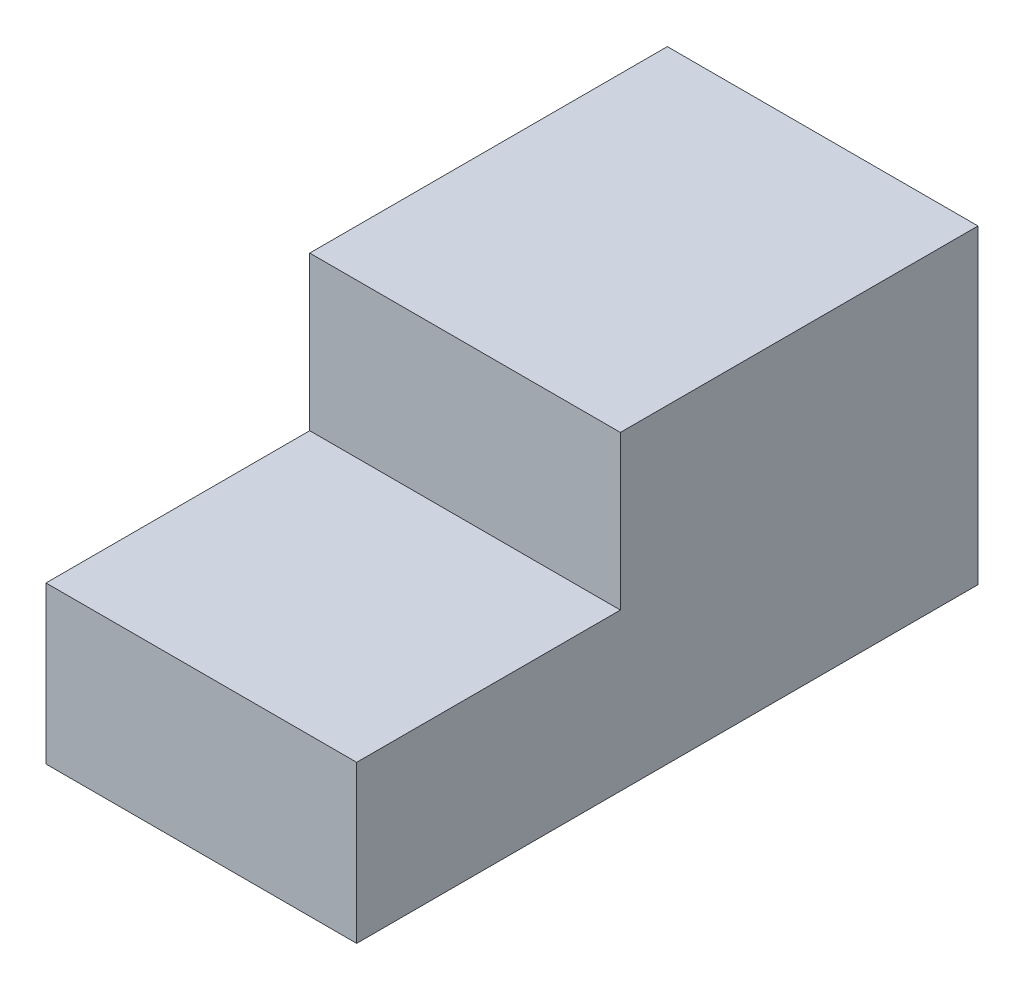
ISO-10303-21;
HEADER;
FILE_DESCRIPTION(('STEP AP214'),'2;1');
FILE_NAME('part.step','',(''),(''),'','','');
FILE_SCHEMA(('AUTOMOTIVE_DESIGN { 1 0 10303 214 1 1 1 1 }'));
ENDSEC;
DATA;
#1=APPLICATION_CONTEXT('core data for automotive mechanical design processes');
#2=APPLICATION_PROTOCOL_DEFINITION('international standard','automotive_design',2000,#1);
#3=PRODUCT_CONTEXT('',#1,'mechanical');
#4=PRODUCT('Part','Part','',(#3));
#5=PRODUCT_RELATED_PRODUCT_CATEGORY('part','',(#4));
#6=PRODUCT_DEFINITION_FORMATION('','',#4);
#7=PRODUCT_DEFINITION_CONTEXT('part definition',#1,'design');
#8=PRODUCT_DEFINITION('design','',#6,#7);
#9=PRODUCT_DEFINITION_SHAPE('','',#8);
#10=(LENGTH_UNIT() NAMED_UNIT(*) SI_UNIT(.MILLI.,.METRE.));
#11=(NAMED_UNIT(*) PLANE_ANGLE_UNIT() SI_UNIT($,.RADIAN.));
#12=(NAMED_UNIT(*) SI_UNIT($,.STERADIAN.) SOLID_ANGLE_UNIT());
#13=UNCERTAINTY_MEASURE_WITH_UNIT(LENGTH_MEASURE(1.E-05),#10,'distance_accuracy_value','');
#14=(GEOMETRIC_REPRESENTATION_CONTEXT(3) GLOBAL_UNCERTAINTY_ASSIGNED_CONTEXT((#13)) GLOBAL_UNIT_ASSIGNED_CONTEXT((#10,
#11,#12)) REPRESENTATION_CONTEXT('',''));
#15=CARTESIAN_POINT('',(0.,0.,0.));
#16=DIRECTION('',(0.,0.,1.));
#17=DIRECTION('',(1.,0.,0.));
#18=AXIS2_PLACEMENT_3D('',#15,#16,#17);
#19=CARTESIAN_POINT('',(500.,-252.411575562701,0.));
#20=DIRECTION('',(0.,1.,0.));
#21=DIRECTION('',(0.,0.,1.));
#22=AXIS2_PLACEMENT_3D('',#19,#20,#21);
#23=PLANE('',#22);
#24=DIRECTION('',(0.,0.,-1.));
#25=VECTOR('',#24,1.);
#26=CARTESIAN_POINT('',(-500.,-252.411575562701,0.));
#27=LINE('',#26,#25);
#28=CARTESIAN_POINT('',(-500.,-252.411575562701,1000.));
#29=VERTEX_POINT('',#28);
#30=CARTESIAN_POINT('',(-500.,-252.411575562701,-1000.));
#31=VERTEX_POINT('',#30);
#32=EDGE_CURVE('E130',#29,#31,#27,.T.);
#33=ORIENTED_EDGE('',*,*,#32,.T.);
#34=DIRECTION('',(-1.,0.,0.));
#35=VECTOR('',#34,1.);
#36=CARTESIAN_POINT('',(500.,-252.411575562701,-1000.));
#37=LINE('',#36,#35);
#38=CARTESIAN_POINT('',(500.,-252.411575562701,-1000.));
#39=VERTEX_POINT('',#38);
#40=EDGE_CURVE('E11',#39,#31,#37,.T.);
#41=ORIENTED_EDGE('',*,*,#40,.F.);
#42=DIRECTION('',(0.,0.,-1.));
#43=VECTOR('',#42,1.);
#44=CARTESIAN_POINT('',(500.,-252.411575562701,0.));
#45=LINE('',#44,#43);
#46=CARTESIAN_POINT('',(500.,-252.411575562701,1000.));
#47=VERTEX_POINT('',#46);
#48=EDGE_CURVE('E150',#47,#39,#45,.T.);
#49=ORIENTED_EDGE('',*,*,#48,.F.);
#50=DIRECTION('',(-1.,0.,0.));
#51=VECTOR('',#50,1.);
#52=CARTESIAN_POINT('',(500.,-252.411575562701,1000.));
#53=LINE('',#52,#51);
#54=EDGE_CURVE('E58',#47,#29,#53,.T.);
#55=ORIENTED_EDGE('',*,*,#54,.T.);
#56=EDGE_LOOP('',(#33,#41,#49,#55));
#57=FACE_BOUND('',#56,.T.);
#58=ADVANCED_FACE('F41',(#57),#23,.F.);
#59=CARTESIAN_POINT('',(500.,0.,-1000.));
#60=DIRECTION('',(0.,0.,1.));
#61=DIRECTION('',(1.,0.,0.));
#62=AXIS2_PLACEMENT_3D('',#59,#60,#61);
#63=PLANE('',#62);
#64=DIRECTION('',(0.,1.,0.));
#65=VECTOR('',#64,1.);
#66=CARTESIAN_POINT('',(-500.,0.,-1000.));
#67=LINE('',#66,#65);
#68=CARTESIAN_POINT('',(-500.,747.588424437299,-1000.));
#69=VERTEX_POINT('',#68);
#70=EDGE_CURVE('E133',#31,#69,#67,.T.);
#71=ORIENTED_EDGE('',*,*,#70,.T.);
#72=DIRECTION('',(-1.,0.,0.));
#73=VECTOR('',#72,1.);
#74=CARTESIAN_POINT('',(500.,747.588424437299,-1000.));
#75=LINE('',#74,#73);
#76=CARTESIAN_POINT('',(500.,747.588424437299,-1000.));
#77=VERTEX_POINT('',#76);
#78=EDGE_CURVE('E50',#77,#69,#75,.T.);
#79=ORIENTED_EDGE('',*,*,#78,.F.);
#80=DIRECTION('',(0.,1.,0.));
#81=VECTOR('',#80,1.);
#82=CARTESIAN_POINT('',(500.,0.,-1000.));
#83=LINE('',#82,#81);
#84=EDGE_CURVE('E90',#39,#77,#83,.T.);
#85=ORIENTED_EDGE('',*,*,#84,.F.);
#86=ORIENTED_EDGE('',*,*,#40,.T.);
#87=EDGE_LOOP('',(#71,#79,#85,#86));
#88=FACE_BOUND('',#87,.T.);
#89=ADVANCED_FACE('F160',(#88),#63,.F.);
#90=CARTESIAN_POINT('',(500.,747.588424437299,0.));
#91=DIRECTION('',(0.,1.,0.));
#92=DIRECTION('',(0.,0.,1.));
#93=AXIS2_PLACEMENT_3D('',#90,#91,#92);
#94=PLANE('',#93);
#95=DIRECTION('',(0.,0.,-1.));
#96=VECTOR('',#95,1.);
#97=CARTESIAN_POINT('',(-500.,747.588424437299,0.));
#98=LINE('',#97,#96);
#99=CARTESIAN_POINT('',(-500.,747.588424437299,151.125401929261));
#100=VERTEX_POINT('',#99);
#101=EDGE_CURVE('E137',#100,#69,#98,.T.);
#102=ORIENTED_EDGE('',*,*,#101,.F.);
#103=DIRECTION('',(-1.,0.,0.));
#104=VECTOR('',#103,1.);
#105=CARTESIAN_POINT('',(500.,747.588424437299,151.125401929261));
#106=LINE('',#105,#104);
#107=CARTESIAN_POINT('',(500.,747.588424437299,151.125401929261));
#108=VERTEX_POINT('',#107);
#109=EDGE_CURVE('E110',#108,#100,#106,.T.);
#110=ORIENTED_EDGE('',*,*,#109,.F.);
#111=DIRECTION('',(0.,0.,-1.));
#112=VECTOR('',#111,1.);
#113=CARTESIAN_POINT('',(500.,747.588424437299,0.));
#114=LINE('',#113,#112);
#115=EDGE_CURVE('E119',#108,#77,#114,.T.);
#116=ORIENTED_EDGE('',*,*,#115,.T.);
#117=ORIENTED_EDGE('',*,*,#78,.T.);
#118=EDGE_LOOP('',(#102,#110,#116,#117));
#119=FACE_BOUND('',#118,.T.);
#120=ADVANCED_FACE('F159',(#119),#94,.T.);
#121=CARTESIAN_POINT('',(500.,0.,151.125401929261));
#122=DIRECTION('',(0.,0.,1.));
#123=DIRECTION('',(1.,0.,0.));
#124=AXIS2_PLACEMENT_3D('',#121,#122,#123);
#125=PLANE('',#124);
#126=DIRECTION('',(0.,1.,0.));
#127=VECTOR('',#126,1.);
#128=CARTESIAN_POINT('',(-500.,0.,151.125401929261));
#129=LINE('',#128,#127);
#130=CARTESIAN_POINT('',(-500.,252.411575562701,151.125401929261));
#131=VERTEX_POINT('',#130);
#132=EDGE_CURVE('E105',#131,#100,#129,.T.);
#133=ORIENTED_EDGE('',*,*,#132,.F.);
#134=DIRECTION('',(-1.,0.,0.));
#135=VECTOR('',#134,1.);
#136=CARTESIAN_POINT('',(500.,252.411575562701,151.125401929261));
#137=LINE('',#136,#135);
#138=CARTESIAN_POINT('',(500.,252.411575562701,151.125401929261));
#139=VERTEX_POINT('',#138);
#140=EDGE_CURVE('E100',#139,#131,#137,.T.);
#141=ORIENTED_EDGE('',*,*,#140,.F.);
#142=DIRECTION('',(0.,1.,0.));
#143=VECTOR('',#142,1.);
#144=CARTESIAN_POINT('',(500.,0.,151.125401929261));
#145=LINE('',#144,#143);
#146=EDGE_CURVE('E103',#139,#108,#145,.T.);
#147=ORIENTED_EDGE('',*,*,#146,.T.);
#148=ORIENTED_EDGE('',*,*,#109,.T.);
#149=EDGE_LOOP('',(#133,#141,#147,#148));
#150=FACE_BOUND('',#149,.T.);
#151=ADVANCED_FACE('F102',(#150),#125,.T.);
#152=CARTESIAN_POINT('',(500.,252.411575562701,0.));
#153=DIRECTION('',(0.,1.,0.));
#154=DIRECTION('',(0.,0.,1.));
#155=AXIS2_PLACEMENT_3D('',#152,#153,#154);
#156=PLANE('',#155);
#157=DIRECTION('',(0.,0.,-1.));
#158=VECTOR('',#157,1.);
#159=CARTESIAN_POINT('',(-500.,252.411575562701,0.));
#160=LINE('',#159,#158);
#161=CARTESIAN_POINT('',(-500.,252.411575562701,1000.));
#162=VERTEX_POINT('',#161);
#163=EDGE_CURVE('E143',#162,#131,#160,.T.);
#164=ORIENTED_EDGE('',*,*,#163,.F.);
#165=DIRECTION('',(-1.,0.,0.));
#166=VECTOR('',#165,1.);
#167=CARTESIAN_POINT('',(500.,252.411575562701,1000.));
#168=LINE('',#167,#166);
#169=CARTESIAN_POINT('',(500.,252.411575562701,1000.));
#170=VERTEX_POINT('',#169);
#171=EDGE_CURVE('E78',#170,#162,#168,.T.);
#172=ORIENTED_EDGE('',*,*,#171,.F.);
#173=DIRECTION('',(0.,0.,-1.));
#174=VECTOR('',#173,1.);
#175=CARTESIAN_POINT('',(500.,252.411575562701,0.));
#176=LINE('',#175,#174);
#177=EDGE_CURVE('E117',#170,#139,#176,.T.);
#178=ORIENTED_EDGE('',*,*,#177,.T.);
#179=ORIENTED_EDGE('',*,*,#140,.T.);
#180=EDGE_LOOP('',(#164,#172,#178,#179));
#181=FACE_BOUND('',#180,.T.);
#182=ADVANCED_FACE('F122',(#181),#156,.T.);
#183=CARTESIAN_POINT('',(500.,0.,1000.));
#184=DIRECTION('',(0.,0.,1.));
#185=DIRECTION('',(1.,0.,0.));
#186=AXIS2_PLACEMENT_3D('',#183,#184,#185);
#187=PLANE('',#186);
#188=DIRECTION('',(0.,1.,0.));
#189=VECTOR('',#188,1.);
#190=CARTESIAN_POINT('',(-500.,0.,1000.));
#191=LINE('',#190,#189);
#192=EDGE_CURVE('E146',#29,#162,#191,.T.);
#193=ORIENTED_EDGE('',*,*,#192,.F.);
#194=ORIENTED_EDGE('',*,*,#54,.F.);
#195=DIRECTION('',(0.,1.,0.));
#196=VECTOR('',#195,1.);
#197=CARTESIAN_POINT('',(500.,0.,1000.));
#198=LINE('',#197,#196);
#199=EDGE_CURVE('E124',#47,#170,#198,.T.);
#200=ORIENTED_EDGE('',*,*,#199,.T.);
#201=ORIENTED_EDGE('',*,*,#171,.T.);
#202=EDGE_LOOP('',(#193,#194,#200,#201));
#203=FACE_BOUND('',#202,.T.);
#204=ADVANCED_FACE('F164',(#203),#187,.T.);
#205=CARTESIAN_POINT('',(500.,0.,0.));
#206=DIRECTION('',(1.,0.,0.));
#207=DIRECTION('',(0.,0.,-1.));
#208=AXIS2_PLACEMENT_3D('',#205,#206,#207);
#209=PLANE('',#208);
#210=ORIENTED_EDGE('',*,*,#48,.T.);
#211=ORIENTED_EDGE('',*,*,#84,.T.);
#212=ORIENTED_EDGE('',*,*,#115,.F.);
#213=ORIENTED_EDGE('',*,*,#146,.F.);
#214=ORIENTED_EDGE('',*,*,#177,.F.);
#215=ORIENTED_EDGE('',*,*,#199,.F.);
#216=EDGE_LOOP('',(#210,#211,#212,#213,#214,#215));
#217=FACE_BOUND('',#216,.T.);
#218=ADVANCED_FACE('F115',(#217),#209,.T.);
#219=CARTESIAN_POINT('',(-500.,0.,0.));
#220=DIRECTION('',(1.,0.,0.));
#221=DIRECTION('',(0.,0.,-1.));
#222=AXIS2_PLACEMENT_3D('',#219,#220,#221);
#223=PLANE('',#222);
#224=ORIENTED_EDGE('',*,*,#32,.F.);
#225=ORIENTED_EDGE('',*,*,#192,.T.);
#226=ORIENTED_EDGE('',*,*,#163,.T.);
#227=ORIENTED_EDGE('',*,*,#132,.T.);
#228=ORIENTED_EDGE('',*,*,#101,.T.);
#229=ORIENTED_EDGE('',*,*,#70,.F.);
#230=EDGE_LOOP('',(#224,#225,#226,#227,#228,#229));
#231=FACE_BOUND('',#230,.T.);
#232=ADVANCED_FACE('F163',(#231),#223,.F.);
#233=CLOSED_SHELL('',(#58,#89,#120,#151,#182,#204,#218,#232));
#234=MANIFOLD_SOLID_BREP('B2',#233);
#235=ADVANCED_BREP_SHAPE_REPRESENTATION('',(#18,#234),#14);
#236=SHAPE_DEFINITION_REPRESENTATION(#9,#235);
ENDSEC;
END-ISO-10303-21;
